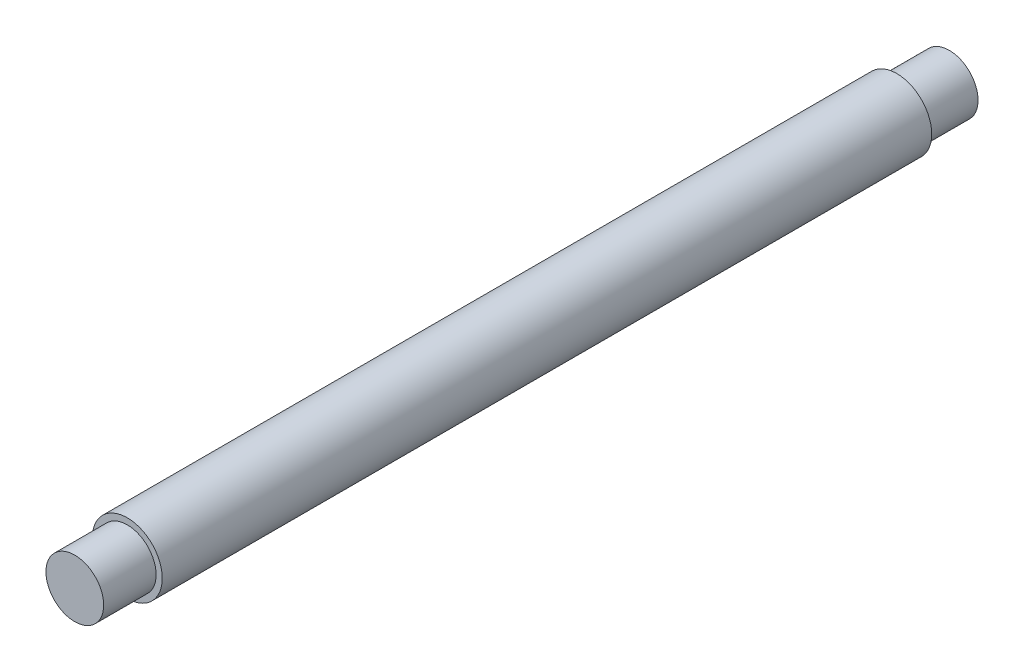
ISO-10303-21;
HEADER;
FILE_DESCRIPTION(('STEP AP214'),'2;1');
FILE_NAME('part.step','',(''),(''),'','','');
FILE_SCHEMA(('AUTOMOTIVE_DESIGN { 1 0 10303 214 1 1 1 1 }'));
ENDSEC;
DATA;
#1=APPLICATION_CONTEXT('core data for automotive mechanical design processes');
#2=APPLICATION_PROTOCOL_DEFINITION('international standard','automotive_design',2000,#1);
#3=PRODUCT_CONTEXT('',#1,'mechanical');
#4=PRODUCT('Part','Part','',(#3));
#5=PRODUCT_RELATED_PRODUCT_CATEGORY('part','',(#4));
#6=PRODUCT_DEFINITION_FORMATION('','',#4);
#7=PRODUCT_DEFINITION_CONTEXT('part definition',#1,'design');
#8=PRODUCT_DEFINITION('design','',#6,#7);
#9=PRODUCT_DEFINITION_SHAPE('','',#8);
#10=(LENGTH_UNIT() NAMED_UNIT(*) SI_UNIT(.MILLI.,.METRE.));
#11=(NAMED_UNIT(*) PLANE_ANGLE_UNIT() SI_UNIT($,.RADIAN.));
#12=(NAMED_UNIT(*) SI_UNIT($,.STERADIAN.) SOLID_ANGLE_UNIT());
#13=UNCERTAINTY_MEASURE_WITH_UNIT(LENGTH_MEASURE(1.E-05),#10,'distance_accuracy_value','');
#14=(GEOMETRIC_REPRESENTATION_CONTEXT(3) GLOBAL_UNCERTAINTY_ASSIGNED_CONTEXT((#13)) GLOBAL_UNIT_ASSIGNED_CONTEXT((#10,
#11,#12)) REPRESENTATION_CONTEXT('',''));
#15=CARTESIAN_POINT('',(0.,0.,0.));
#16=DIRECTION('',(0.,0.,1.));
#17=DIRECTION('',(1.,0.,0.));
#18=AXIS2_PLACEMENT_3D('',#15,#16,#17);
#19=CARTESIAN_POINT('',(0.,0.,-220.));
#20=DIRECTION('',(0.,0.,1.));
#21=DIRECTION('',(1.,0.,0.));
#22=AXIS2_PLACEMENT_3D('',#19,#20,#21);
#23=CYLINDRICAL_SURFACE('',#22,20.);
#24=CARTESIAN_POINT('',(0.,0.,-220.));
#25=DIRECTION('',(0.,0.,1.));
#26=DIRECTION('',(1.,0.,0.));
#27=AXIS2_PLACEMENT_3D('',#24,#25,#26);
#28=CIRCLE('',#27,20.);
#29=CARTESIAN_POINT('',(20.,0.,-220.));
#30=VERTEX_POINT('',#29);
#31=EDGE_CURVE('E37',#30,#30,#28,.T.);
#32=ORIENTED_EDGE('',*,*,#31,.T.);
#33=EDGE_LOOP('',(#32));
#34=FACE_BOUND('',#33,.T.);
#35=CARTESIAN_POINT('',(0.,0.,220.));
#36=DIRECTION('',(0.,0.,1.));
#37=DIRECTION('',(1.,0.,0.));
#38=AXIS2_PLACEMENT_3D('',#35,#36,#37);
#39=CIRCLE('',#38,20.);
#40=CARTESIAN_POINT('',(20.,0.,220.));
#41=VERTEX_POINT('',#40);
#42=EDGE_CURVE('E52',#41,#41,#39,.T.);
#43=ORIENTED_EDGE('',*,*,#42,.F.);
#44=EDGE_LOOP('',(#43));
#45=FACE_BOUND('',#44,.T.);
#46=ADVANCED_FACE('F34',(#34,#45),#23,.T.);
#47=CARTESIAN_POINT('',(0.,0.,-220.));
#48=DIRECTION('',(0.,0.,1.));
#49=DIRECTION('',(1.,0.,0.));
#50=AXIS2_PLACEMENT_3D('',#47,#48,#49);
#51=PLANE('',#50);
#52=CARTESIAN_POINT('',(0.,0.,-220.));
#53=DIRECTION('',(0.,0.,-1.));
#54=DIRECTION('',(-1.,0.,0.));
#55=AXIS2_PLACEMENT_3D('',#52,#53,#54);
#56=CIRCLE('',#55,16.5);
#57=CARTESIAN_POINT('',(-16.5,0.,-220.));
#58=VERTEX_POINT('',#57);
#59=EDGE_CURVE('E10',#58,#58,#56,.T.);
#60=ORIENTED_EDGE('',*,*,#59,.F.);
#61=EDGE_LOOP('',(#60));
#62=FACE_BOUND('',#61,.T.);
#63=ORIENTED_EDGE('',*,*,#31,.F.);
#64=EDGE_LOOP('',(#63));
#65=FACE_BOUND('',#64,.T.);
#66=ADVANCED_FACE('F61',(#62,#65),#51,.F.);
#67=CARTESIAN_POINT('',(0.,0.,220.));
#68=DIRECTION('',(0.,0.,1.));
#69=DIRECTION('',(1.,0.,0.));
#70=AXIS2_PLACEMENT_3D('',#67,#68,#69);
#71=PLANE('',#70);
#72=CARTESIAN_POINT('',(0.,0.,220.));
#73=DIRECTION('',(0.,0.,1.));
#74=DIRECTION('',(1.,0.,0.));
#75=AXIS2_PLACEMENT_3D('',#72,#73,#74);
#76=CIRCLE('',#75,16.5);
#77=CARTESIAN_POINT('',(16.5,0.,220.));
#78=VERTEX_POINT('',#77);
#79=EDGE_CURVE('E41',#78,#78,#76,.T.);
#80=ORIENTED_EDGE('',*,*,#79,.F.);
#81=EDGE_LOOP('',(#80));
#82=FACE_BOUND('',#81,.T.);
#83=ORIENTED_EDGE('',*,*,#42,.T.);
#84=EDGE_LOOP('',(#83));
#85=FACE_BOUND('',#84,.T.);
#86=ADVANCED_FACE('F63',(#82,#85),#71,.T.);
#87=CARTESIAN_POINT('',(0.,0.,250.));
#88=DIRECTION('',(0.,0.,-1.));
#89=DIRECTION('',(-1.,0.,0.));
#90=AXIS2_PLACEMENT_3D('',#87,#88,#89);
#91=CYLINDRICAL_SURFACE('',#90,16.5);
#92=CARTESIAN_POINT('',(0.,0.,250.));
#93=DIRECTION('',(0.,0.,1.));
#94=DIRECTION('',(1.,0.,0.));
#95=AXIS2_PLACEMENT_3D('',#92,#93,#94);
#96=CIRCLE('',#95,16.5);
#97=CARTESIAN_POINT('',(16.5,0.,250.));
#98=VERTEX_POINT('',#97);
#99=EDGE_CURVE('E50',#98,#98,#96,.T.);
#100=ORIENTED_EDGE('',*,*,#99,.F.);
#101=EDGE_LOOP('',(#100));
#102=FACE_BOUND('',#101,.T.);
#103=ORIENTED_EDGE('',*,*,#79,.T.);
#104=EDGE_LOOP('',(#103));
#105=FACE_BOUND('',#104,.T.);
#106=ADVANCED_FACE('F69',(#102,#105),#91,.T.);
#107=CARTESIAN_POINT('',(0.,0.,250.));
#108=DIRECTION('',(0.,0.,1.));
#109=DIRECTION('',(1.,0.,0.));
#110=AXIS2_PLACEMENT_3D('',#107,#108,#109);
#111=PLANE('',#110);
#112=ORIENTED_EDGE('',*,*,#99,.T.);
#113=EDGE_LOOP('',(#112));
#114=FACE_BOUND('',#113,.T.);
#115=ADVANCED_FACE('F75',(#114),#111,.T.);
#116=CARTESIAN_POINT('',(0.,0.,-250.));
#117=DIRECTION('',(0.,0.,1.));
#118=DIRECTION('',(1.,0.,0.));
#119=AXIS2_PLACEMENT_3D('',#116,#117,#118);
#120=CYLINDRICAL_SURFACE('',#119,16.5);
#121=CARTESIAN_POINT('',(0.,0.,-250.));
#122=DIRECTION('',(0.,0.,-1.));
#123=DIRECTION('',(-1.,0.,0.));
#124=AXIS2_PLACEMENT_3D('',#121,#122,#123);
#125=CIRCLE('',#124,16.5);
#126=CARTESIAN_POINT('',(-16.5,0.,-250.));
#127=VERTEX_POINT('',#126);
#128=EDGE_CURVE('E49',#127,#127,#125,.T.);
#129=ORIENTED_EDGE('',*,*,#128,.F.);
#130=EDGE_LOOP('',(#129));
#131=FACE_BOUND('',#130,.T.);
#132=ORIENTED_EDGE('',*,*,#59,.T.);
#133=EDGE_LOOP('',(#132));
#134=FACE_BOUND('',#133,.T.);
#135=ADVANCED_FACE('F79',(#131,#134),#120,.T.);
#136=CARTESIAN_POINT('',(0.,0.,-250.));
#137=DIRECTION('',(0.,0.,-1.));
#138=DIRECTION('',(-1.,0.,0.));
#139=AXIS2_PLACEMENT_3D('',#136,#137,#138);
#140=PLANE('',#139);
#141=ORIENTED_EDGE('',*,*,#128,.T.);
#142=EDGE_LOOP('',(#141));
#143=FACE_BOUND('',#142,.T.);
#144=ADVANCED_FACE('F83',(#143),#140,.T.);
#145=CLOSED_SHELL('',(#46,#66,#86,#106,#115,#135,#144));
#146=MANIFOLD_SOLID_BREP('B2',#145);
#147=ADVANCED_BREP_SHAPE_REPRESENTATION('',(#18,#146),#14);
#148=SHAPE_DEFINITION_REPRESENTATION(#9,#147);
ENDSEC;
END-ISO-10303-21;
